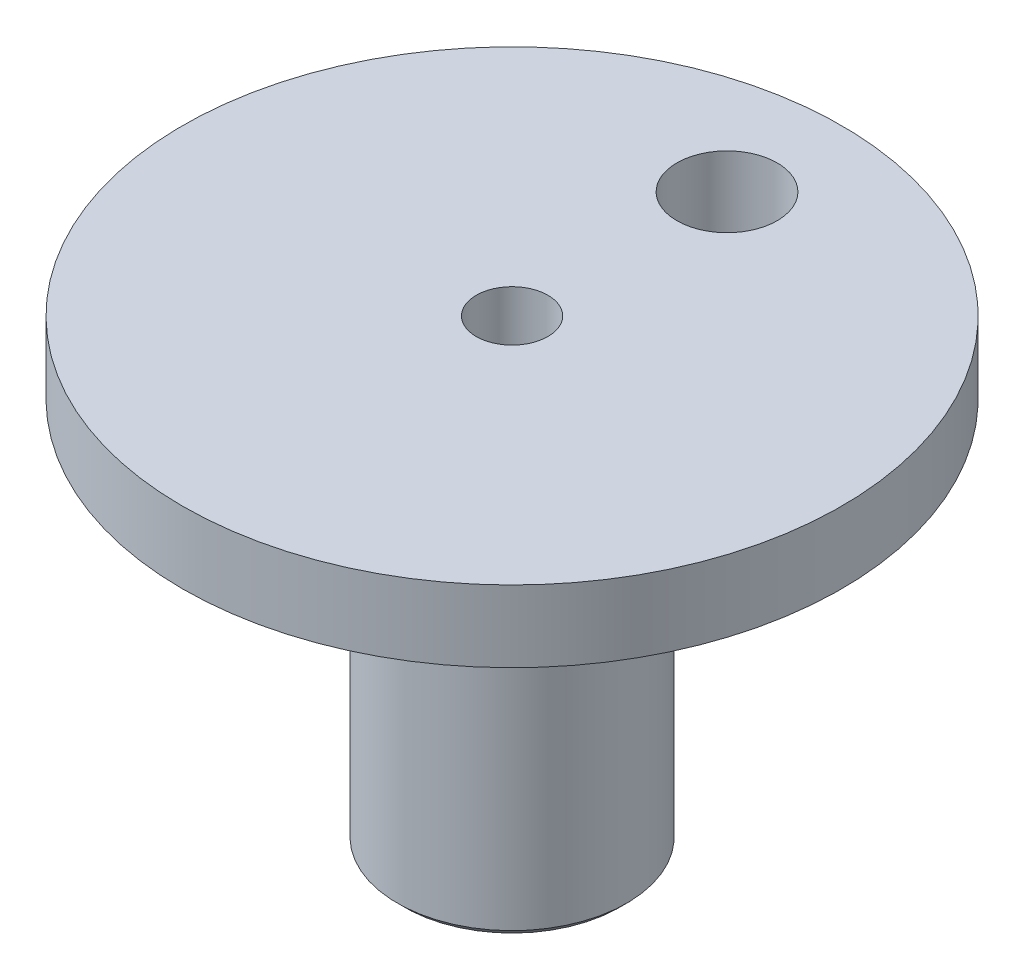
ISO-10303-21;
HEADER;
FILE_DESCRIPTION(('STEP AP214'),'2;1');
FILE_NAME('part.step','',(''),(''),'','','');
FILE_SCHEMA(('AUTOMOTIVE_DESIGN { 1 0 10303 214 1 1 1 1 }'));
ENDSEC;
DATA;
#1=APPLICATION_CONTEXT('core data for automotive mechanical design processes');
#2=APPLICATION_PROTOCOL_DEFINITION('international standard','automotive_design',2000,#1);
#3=PRODUCT_CONTEXT('',#1,'mechanical');
#4=PRODUCT('Part','Part','',(#3));
#5=PRODUCT_RELATED_PRODUCT_CATEGORY('part','',(#4));
#6=PRODUCT_DEFINITION_FORMATION('','',#4);
#7=PRODUCT_DEFINITION_CONTEXT('part definition',#1,'design');
#8=PRODUCT_DEFINITION('design','',#6,#7);
#9=PRODUCT_DEFINITION_SHAPE('','',#8);
#10=(LENGTH_UNIT() NAMED_UNIT(*) SI_UNIT(.MILLI.,.METRE.));
#11=(NAMED_UNIT(*) PLANE_ANGLE_UNIT() SI_UNIT($,.RADIAN.));
#12=(NAMED_UNIT(*) SI_UNIT($,.STERADIAN.) SOLID_ANGLE_UNIT());
#13=UNCERTAINTY_MEASURE_WITH_UNIT(LENGTH_MEASURE(1.E-05),#10,'distance_accuracy_value','');
#14=(GEOMETRIC_REPRESENTATION_CONTEXT(3) GLOBAL_UNCERTAINTY_ASSIGNED_CONTEXT((#13)) GLOBAL_UNIT_ASSIGNED_CONTEXT((#10,
#11,#12)) REPRESENTATION_CONTEXT('',''));
#15=CARTESIAN_POINT('',(0.,0.,0.));
#16=DIRECTION('',(0.,0.,1.));
#17=DIRECTION('',(1.,0.,0.));
#18=AXIS2_PLACEMENT_3D('',#15,#16,#17);
#19=CARTESIAN_POINT('',(0.,5.,0.));
#20=DIRECTION('',(0.,1.,0.));
#21=DIRECTION('',(0.,0.,1.));
#22=AXIS2_PLACEMENT_3D('',#19,#20,#21);
#23=PLANE('',#22);
#24=CARTESIAN_POINT('',(0.,5.,0.));
#25=DIRECTION('',(0.,1.,0.));
#26=DIRECTION('',(0.,0.,1.));
#27=AXIS2_PLACEMENT_3D('',#24,#25,#26);
#28=CIRCLE('',#27,2.5);
#29=CARTESIAN_POINT('',(0.,5.,2.5));
#30=VERTEX_POINT('',#29);
#31=EDGE_CURVE('E63',#30,#30,#28,.T.);
#32=ORIENTED_EDGE('',*,*,#31,.F.);
#33=EDGE_LOOP('',(#32));
#34=FACE_BOUND('',#33,.T.);
#35=CARTESIAN_POINT('',(0.,5.,0.));
#36=DIRECTION('',(0.,1.,0.));
#37=DIRECTION('',(0.,0.,1.));
#38=AXIS2_PLACEMENT_3D('',#35,#36,#37);
#39=CIRCLE('',#38,23.);
#40=CARTESIAN_POINT('',(0.,5.,23.));
#41=VERTEX_POINT('',#40);
#42=EDGE_CURVE('E48',#41,#41,#39,.T.);
#43=ORIENTED_EDGE('',*,*,#42,.T.);
#44=EDGE_LOOP('',(#43));
#45=FACE_BOUND('',#44,.T.);
#46=CARTESIAN_POINT('',(0.,5.,-15.));
#47=DIRECTION('',(0.,1.,0.));
#48=DIRECTION('',(0.,0.,1.));
#49=AXIS2_PLACEMENT_3D('',#46,#47,#48);
#50=CIRCLE('',#49,3.5);
#51=CARTESIAN_POINT('',(0.,5.,-11.5));
#52=VERTEX_POINT('',#51);
#53=EDGE_CURVE('E54',#52,#52,#50,.T.);
#54=ORIENTED_EDGE('',*,*,#53,.F.);
#55=EDGE_LOOP('',(#54));
#56=FACE_BOUND('',#55,.T.);
#57=ADVANCED_FACE('F32',(#34,#45,#56),#23,.T.);
#58=CARTESIAN_POINT('',(0.,0.,0.));
#59=DIRECTION('',(0.,1.,0.));
#60=DIRECTION('',(0.,0.,1.));
#61=AXIS2_PLACEMENT_3D('',#58,#59,#60);
#62=PLANE('',#61);
#63=CARTESIAN_POINT('',(0.,0.,0.));
#64=DIRECTION('',(0.,-1.,0.));
#65=DIRECTION('',(0.,0.,-1.));
#66=AXIS2_PLACEMENT_3D('',#63,#64,#65);
#67=CIRCLE('',#66,8.);
#68=CARTESIAN_POINT('',(0.,0.,-8.));
#69=VERTEX_POINT('',#68);
#70=EDGE_CURVE('E44',#69,#69,#67,.T.);
#71=ORIENTED_EDGE('',*,*,#70,.F.);
#72=EDGE_LOOP('',(#71));
#73=FACE_BOUND('',#72,.T.);
#74=CARTESIAN_POINT('',(0.,0.,0.));
#75=DIRECTION('',(0.,1.,0.));
#76=DIRECTION('',(0.,0.,1.));
#77=AXIS2_PLACEMENT_3D('',#74,#75,#76);
#78=CIRCLE('',#77,23.);
#79=CARTESIAN_POINT('',(0.,0.,23.));
#80=VERTEX_POINT('',#79);
#81=EDGE_CURVE('E51',#80,#80,#78,.T.);
#82=ORIENTED_EDGE('',*,*,#81,.F.);
#83=EDGE_LOOP('',(#82));
#84=FACE_BOUND('',#83,.T.);
#85=CARTESIAN_POINT('',(0.,0.,-15.));
#86=DIRECTION('',(0.,1.,0.));
#87=DIRECTION('',(0.,0.,1.));
#88=AXIS2_PLACEMENT_3D('',#85,#86,#87);
#89=CIRCLE('',#88,3.5);
#90=CARTESIAN_POINT('',(0.,0.,-11.5));
#91=VERTEX_POINT('',#90);
#92=EDGE_CURVE('E57',#91,#91,#89,.T.);
#93=ORIENTED_EDGE('',*,*,#92,.T.);
#94=EDGE_LOOP('',(#93));
#95=FACE_BOUND('',#94,.T.);
#96=ADVANCED_FACE('F79',(#73,#84,#95),#62,.F.);
#97=CARTESIAN_POINT('',(0.,5.,0.));
#98=DIRECTION('',(0.,-1.,0.));
#99=DIRECTION('',(0.,0.,-1.));
#100=AXIS2_PLACEMENT_3D('',#97,#98,#99);
#101=CYLINDRICAL_SURFACE('',#100,23.);
#102=ORIENTED_EDGE('',*,*,#42,.F.);
#103=EDGE_LOOP('',(#102));
#104=FACE_BOUND('',#103,.T.);
#105=ORIENTED_EDGE('',*,*,#81,.T.);
#106=EDGE_LOOP('',(#105));
#107=FACE_BOUND('',#106,.T.);
#108=ADVANCED_FACE('F89',(#104,#107),#101,.T.);
#109=CARTESIAN_POINT('',(0.,5.,-15.));
#110=DIRECTION('',(0.,-1.,0.));
#111=DIRECTION('',(0.,0.,-1.));
#112=AXIS2_PLACEMENT_3D('',#109,#110,#111);
#113=CYLINDRICAL_SURFACE('',#112,3.5);
#114=ORIENTED_EDGE('',*,*,#53,.T.);
#115=EDGE_LOOP('',(#114));
#116=FACE_BOUND('',#115,.T.);
#117=ORIENTED_EDGE('',*,*,#92,.F.);
#118=EDGE_LOOP('',(#117));
#119=FACE_BOUND('',#118,.T.);
#120=ADVANCED_FACE('F85',(#116,#119),#113,.F.);
#121=CARTESIAN_POINT('',(0.,-27.,0.));
#122=DIRECTION('',(0.,1.,0.));
#123=DIRECTION('',(0.,0.,1.));
#124=AXIS2_PLACEMENT_3D('',#121,#122,#123);
#125=CYLINDRICAL_SURFACE('',#124,8.);
#126=CARTESIAN_POINT('',(0.,-26.5,0.));
#127=DIRECTION('',(0.,-1.,0.));
#128=DIRECTION('',(0.,0.,-1.));
#129=AXIS2_PLACEMENT_3D('',#126,#127,#128);
#130=CIRCLE('',#129,8.);
#131=CARTESIAN_POINT('',(0.,-26.5,-8.));
#132=VERTEX_POINT('',#131);
#133=EDGE_CURVE('E10',#132,#132,#130,.F.);
#134=ORIENTED_EDGE('',*,*,#133,.T.);
#135=EDGE_LOOP('',(#134));
#136=FACE_BOUND('',#135,.T.);
#137=ORIENTED_EDGE('',*,*,#70,.T.);
#138=EDGE_LOOP('',(#137));
#139=FACE_BOUND('',#138,.T.);
#140=ADVANCED_FACE('F88',(#136,#139),#125,.T.);
#141=CARTESIAN_POINT('',(0.,-27.,0.));
#142=DIRECTION('',(0.,-1.,0.));
#143=DIRECTION('',(0.,0.,-1.));
#144=AXIS2_PLACEMENT_3D('',#141,#142,#143);
#145=PLANE('',#144);
#146=CARTESIAN_POINT('',(0.,-27.,0.));
#147=DIRECTION('',(0.,-1.,0.));
#148=DIRECTION('',(0.,0.,-1.));
#149=AXIS2_PLACEMENT_3D('',#146,#147,#148);
#150=CIRCLE('',#149,7.49999999999999);
#151=CARTESIAN_POINT('',(0.,-27.,-7.49999999999999));
#152=VERTEX_POINT('',#151);
#153=EDGE_CURVE('E40',#152,#152,#150,.T.);
#154=ORIENTED_EDGE('',*,*,#153,.T.);
#155=EDGE_LOOP('',(#154));
#156=FACE_BOUND('',#155,.T.);
#157=CARTESIAN_POINT('',(0.,-27.,0.));
#158=DIRECTION('',(0.,1.,0.));
#159=DIRECTION('',(0.,0.,1.));
#160=AXIS2_PLACEMENT_3D('',#157,#158,#159);
#161=CIRCLE('',#160,2.5);
#162=CARTESIAN_POINT('',(0.,-27.,2.5));
#163=VERTEX_POINT('',#162);
#164=EDGE_CURVE('E60',#163,#163,#161,.T.);
#165=ORIENTED_EDGE('',*,*,#164,.T.);
#166=EDGE_LOOP('',(#165));
#167=FACE_BOUND('',#166,.T.);
#168=ADVANCED_FACE('F69',(#156,#167),#145,.T.);
#169=CARTESIAN_POINT('',(0.,-27.,0.));
#170=DIRECTION('',(0.,1.,0.));
#171=DIRECTION('',(0.,0.,1.));
#172=AXIS2_PLACEMENT_3D('',#169,#170,#171);
#173=CYLINDRICAL_SURFACE('',#172,2.5);
#174=ORIENTED_EDGE('',*,*,#164,.F.);
#175=EDGE_LOOP('',(#174));
#176=FACE_BOUND('',#175,.T.);
#177=ORIENTED_EDGE('',*,*,#31,.T.);
#178=EDGE_LOOP('',(#177));
#179=FACE_BOUND('',#178,.T.);
#180=ADVANCED_FACE('F71',(#176,#179),#173,.F.);
#181=CARTESIAN_POINT('',(0.,-27.,0.));
#182=DIRECTION('',(0.,1.,0.));
#183=DIRECTION('',(0.,0.,1.));
#184=AXIS2_PLACEMENT_3D('',#181,#182,#183);
#185=CONICAL_SURFACE('',#184,7.49999999999999,0.785398163397459);
#186=ORIENTED_EDGE('',*,*,#133,.F.);
#187=EDGE_LOOP('',(#186));
#188=FACE_BOUND('',#187,.T.);
#189=ORIENTED_EDGE('',*,*,#153,.F.);
#190=EDGE_LOOP('',(#189));
#191=FACE_BOUND('',#190,.T.);
#192=ADVANCED_FACE('F35',(#188,#191),#185,.T.);
#193=CLOSED_SHELL('',(#57,#96,#108,#120,#140,#168,#180,#192));
#194=MANIFOLD_SOLID_BREP('B2',#193);
#195=ADVANCED_BREP_SHAPE_REPRESENTATION('',(#18,#194),#14);
#196=SHAPE_DEFINITION_REPRESENTATION(#9,#195);
ENDSEC;
END-ISO-10303-21;
